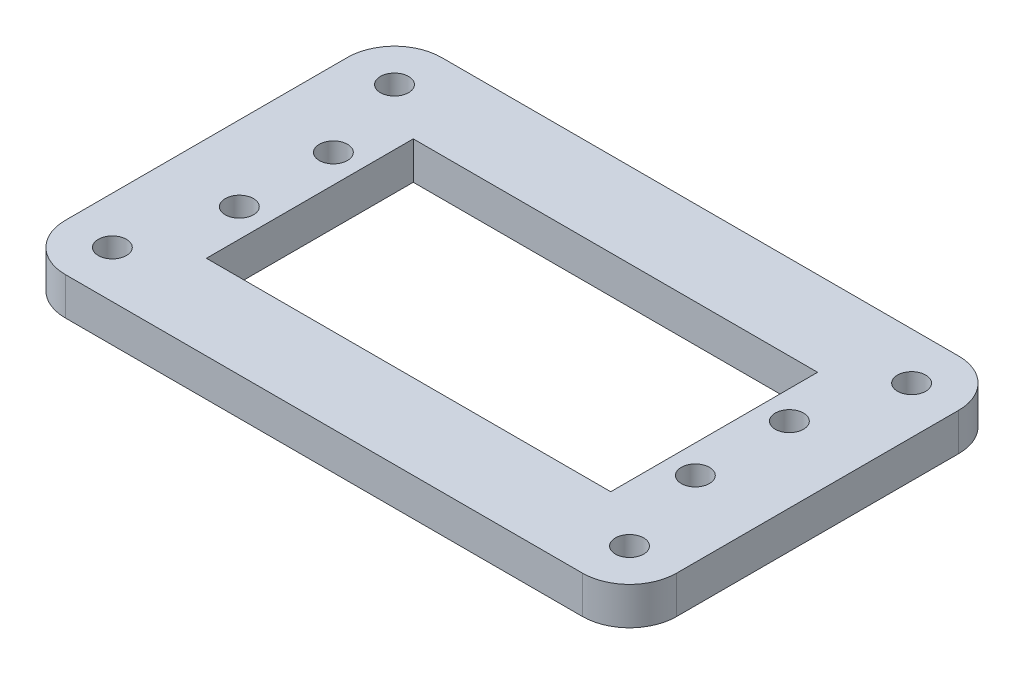
ISO-10303-21;
HEADER;
FILE_DESCRIPTION(('STEP AP214'),'2;1');
FILE_NAME('part.step','',(''),(''),'','','');
FILE_SCHEMA(('AUTOMOTIVE_DESIGN { 1 0 10303 214 1 1 1 1 }'));
ENDSEC;
DATA;
#1=APPLICATION_CONTEXT('core data for automotive mechanical design processes');
#2=APPLICATION_PROTOCOL_DEFINITION('international standard','automotive_design',2000,#1);
#3=PRODUCT_CONTEXT('',#1,'mechanical');
#4=PRODUCT('Part','Part','',(#3));
#5=PRODUCT_RELATED_PRODUCT_CATEGORY('part','',(#4));
#6=PRODUCT_DEFINITION_FORMATION('','',#4);
#7=PRODUCT_DEFINITION_CONTEXT('part definition',#1,'design');
#8=PRODUCT_DEFINITION('design','',#6,#7);
#9=PRODUCT_DEFINITION_SHAPE('','',#8);
#10=(LENGTH_UNIT() NAMED_UNIT(*) SI_UNIT(.MILLI.,.METRE.));
#11=(NAMED_UNIT(*) PLANE_ANGLE_UNIT() SI_UNIT($,.RADIAN.));
#12=(NAMED_UNIT(*) SI_UNIT($,.STERADIAN.) SOLID_ANGLE_UNIT());
#13=UNCERTAINTY_MEASURE_WITH_UNIT(LENGTH_MEASURE(1.E-05),#10,'distance_accuracy_value','');
#14=(GEOMETRIC_REPRESENTATION_CONTEXT(3) GLOBAL_UNCERTAINTY_ASSIGNED_CONTEXT((#13)) GLOBAL_UNIT_ASSIGNED_CONTEXT((#10,
#11,#12)) REPRESENTATION_CONTEXT('',''));
#15=CARTESIAN_POINT('',(0.,0.,0.));
#16=DIRECTION('',(0.,0.,1.));
#17=DIRECTION('',(1.,0.,0.));
#18=AXIS2_PLACEMENT_3D('',#15,#16,#17);
#19=CARTESIAN_POINT('',(-27.5,4.,15.));
#20=DIRECTION('',(0.,-1.,0.));
#21=DIRECTION('',(0.,0.,-1.));
#22=AXIS2_PLACEMENT_3D('',#19,#20,#21);
#23=CYLINDRICAL_SURFACE('',#22,5.);
#24=DIRECTION('',(0.,-1.,0.));
#25=VECTOR('',#24,1.);
#26=CARTESIAN_POINT('',(-27.5,4.,20.));
#27=LINE('',#26,#25);
#28=CARTESIAN_POINT('',(-27.5,4.,20.));
#29=VERTEX_POINT('',#28);
#30=CARTESIAN_POINT('',(-27.5,0.,20.));
#31=VERTEX_POINT('',#30);
#32=EDGE_CURVE('E253',#29,#31,#27,.T.);
#33=ORIENTED_EDGE('',*,*,#32,.F.);
#34=CARTESIAN_POINT('',(-27.5,4.,15.));
#35=DIRECTION('',(0.,1.,0.));
#36=DIRECTION('',(0.,0.,1.));
#37=AXIS2_PLACEMENT_3D('',#34,#35,#36);
#38=CIRCLE('',#37,5.);
#39=CARTESIAN_POINT('',(-32.5,4.,15.));
#40=VERTEX_POINT('',#39);
#41=EDGE_CURVE('E47',#40,#29,#38,.T.);
#42=ORIENTED_EDGE('',*,*,#41,.F.);
#43=DIRECTION('',(0.,-1.,0.));
#44=VECTOR('',#43,1.);
#45=CARTESIAN_POINT('',(-32.5,4.,15.));
#46=LINE('',#45,#44);
#47=CARTESIAN_POINT('',(-32.5,0.,15.));
#48=VERTEX_POINT('',#47);
#49=EDGE_CURVE('E257',#48,#40,#46,.F.);
#50=ORIENTED_EDGE('',*,*,#49,.F.);
#51=CARTESIAN_POINT('',(-27.5,0.,15.));
#52=DIRECTION('',(0.,1.,0.));
#53=DIRECTION('',(0.,0.,1.));
#54=AXIS2_PLACEMENT_3D('',#51,#52,#53);
#55=CIRCLE('',#54,5.);
#56=EDGE_CURVE('E11',#31,#48,#55,.F.);
#57=ORIENTED_EDGE('',*,*,#56,.F.);
#58=EDGE_LOOP('',(#33,#42,#50,#57));
#59=FACE_BOUND('',#58,.T.);
#60=ADVANCED_FACE('F39',(#59),#23,.T.);
#61=CARTESIAN_POINT('',(27.5,4.,15.));
#62=DIRECTION('',(0.,-1.,0.));
#63=DIRECTION('',(0.,0.,-1.));
#64=AXIS2_PLACEMENT_3D('',#61,#62,#63);
#65=CYLINDRICAL_SURFACE('',#64,5.);
#66=DIRECTION('',(0.,-1.,0.));
#67=VECTOR('',#66,1.);
#68=CARTESIAN_POINT('',(32.5,4.,15.));
#69=LINE('',#68,#67);
#70=CARTESIAN_POINT('',(32.5,4.,15.));
#71=VERTEX_POINT('',#70);
#72=CARTESIAN_POINT('',(32.5,0.,15.));
#73=VERTEX_POINT('',#72);
#74=EDGE_CURVE('E238',#71,#73,#69,.T.);
#75=ORIENTED_EDGE('',*,*,#74,.F.);
#76=CARTESIAN_POINT('',(27.5,4.,15.));
#77=DIRECTION('',(0.,1.,0.));
#78=DIRECTION('',(0.,0.,1.));
#79=AXIS2_PLACEMENT_3D('',#76,#77,#78);
#80=CIRCLE('',#79,5.);
#81=CARTESIAN_POINT('',(27.5,4.,20.));
#82=VERTEX_POINT('',#81);
#83=EDGE_CURVE('E246',#82,#71,#80,.T.);
#84=ORIENTED_EDGE('',*,*,#83,.F.);
#85=DIRECTION('',(0.,-1.,0.));
#86=VECTOR('',#85,1.);
#87=CARTESIAN_POINT('',(27.5,4.,20.));
#88=LINE('',#87,#86);
#89=CARTESIAN_POINT('',(27.5,0.,20.));
#90=VERTEX_POINT('',#89);
#91=EDGE_CURVE('E242',#90,#82,#88,.F.);
#92=ORIENTED_EDGE('',*,*,#91,.F.);
#93=CARTESIAN_POINT('',(27.5,0.,15.));
#94=DIRECTION('',(0.,1.,0.));
#95=DIRECTION('',(0.,0.,1.));
#96=AXIS2_PLACEMENT_3D('',#93,#94,#95);
#97=CIRCLE('',#96,5.);
#98=EDGE_CURVE('E249',#73,#90,#97,.F.);
#99=ORIENTED_EDGE('',*,*,#98,.F.);
#100=EDGE_LOOP('',(#75,#84,#92,#99));
#101=FACE_BOUND('',#100,.T.);
#102=ADVANCED_FACE('F269',(#101),#65,.T.);
#103=CARTESIAN_POINT('',(27.5,4.,-15.));
#104=DIRECTION('',(0.,-1.,0.));
#105=DIRECTION('',(0.,0.,-1.));
#106=AXIS2_PLACEMENT_3D('',#103,#104,#105);
#107=CYLINDRICAL_SURFACE('',#106,5.);
#108=DIRECTION('',(0.,-1.,0.));
#109=VECTOR('',#108,1.);
#110=CARTESIAN_POINT('',(27.5,4.,-20.));
#111=LINE('',#110,#109);
#112=CARTESIAN_POINT('',(27.5,4.,-20.));
#113=VERTEX_POINT('',#112);
#114=CARTESIAN_POINT('',(27.5,0.,-20.));
#115=VERTEX_POINT('',#114);
#116=EDGE_CURVE('E223',#113,#115,#111,.T.);
#117=ORIENTED_EDGE('',*,*,#116,.F.);
#118=CARTESIAN_POINT('',(27.5,4.,-15.));
#119=DIRECTION('',(0.,1.,0.));
#120=DIRECTION('',(0.,0.,1.));
#121=AXIS2_PLACEMENT_3D('',#118,#119,#120);
#122=CIRCLE('',#121,5.);
#123=CARTESIAN_POINT('',(32.5,4.,-15.));
#124=VERTEX_POINT('',#123);
#125=EDGE_CURVE('E231',#124,#113,#122,.T.);
#126=ORIENTED_EDGE('',*,*,#125,.F.);
#127=DIRECTION('',(0.,-1.,0.));
#128=VECTOR('',#127,1.);
#129=CARTESIAN_POINT('',(32.5,4.,-15.));
#130=LINE('',#129,#128);
#131=CARTESIAN_POINT('',(32.5,0.,-15.));
#132=VERTEX_POINT('',#131);
#133=EDGE_CURVE('E227',#132,#124,#130,.F.);
#134=ORIENTED_EDGE('',*,*,#133,.F.);
#135=CARTESIAN_POINT('',(27.5,0.,-15.));
#136=DIRECTION('',(0.,1.,0.));
#137=DIRECTION('',(0.,0.,1.));
#138=AXIS2_PLACEMENT_3D('',#135,#136,#137);
#139=CIRCLE('',#138,5.);
#140=EDGE_CURVE('E234',#115,#132,#139,.F.);
#141=ORIENTED_EDGE('',*,*,#140,.F.);
#142=EDGE_LOOP('',(#117,#126,#134,#141));
#143=FACE_BOUND('',#142,.T.);
#144=ADVANCED_FACE('F276',(#143),#107,.T.);
#145=CARTESIAN_POINT('',(-27.5,4.,-15.));
#146=DIRECTION('',(0.,-1.,0.));
#147=DIRECTION('',(0.,0.,-1.));
#148=AXIS2_PLACEMENT_3D('',#145,#146,#147);
#149=CYLINDRICAL_SURFACE('',#148,5.);
#150=DIRECTION('',(0.,-1.,0.));
#151=VECTOR('',#150,1.);
#152=CARTESIAN_POINT('',(-32.5,4.,-15.));
#153=LINE('',#152,#151);
#154=CARTESIAN_POINT('',(-32.5,4.,-15.));
#155=VERTEX_POINT('',#154);
#156=CARTESIAN_POINT('',(-32.5,0.,-15.));
#157=VERTEX_POINT('',#156);
#158=EDGE_CURVE('E197',#155,#157,#153,.T.);
#159=ORIENTED_EDGE('',*,*,#158,.F.);
#160=CARTESIAN_POINT('',(-27.5,4.,-15.));
#161=DIRECTION('',(0.,1.,0.));
#162=DIRECTION('',(0.,0.,1.));
#163=AXIS2_PLACEMENT_3D('',#160,#161,#162);
#164=CIRCLE('',#163,5.);
#165=CARTESIAN_POINT('',(-27.5,4.,-20.));
#166=VERTEX_POINT('',#165);
#167=EDGE_CURVE('E216',#166,#155,#164,.T.);
#168=ORIENTED_EDGE('',*,*,#167,.F.);
#169=DIRECTION('',(0.,-1.,0.));
#170=VECTOR('',#169,1.);
#171=CARTESIAN_POINT('',(-27.5,4.,-20.));
#172=LINE('',#171,#170);
#173=CARTESIAN_POINT('',(-27.5,0.,-20.));
#174=VERTEX_POINT('',#173);
#175=EDGE_CURVE('E212',#174,#166,#172,.F.);
#176=ORIENTED_EDGE('',*,*,#175,.F.);
#177=CARTESIAN_POINT('',(-27.5,0.,-15.));
#178=DIRECTION('',(0.,1.,0.));
#179=DIRECTION('',(0.,0.,1.));
#180=AXIS2_PLACEMENT_3D('',#177,#178,#179);
#181=CIRCLE('',#180,5.);
#182=EDGE_CURVE('E219',#157,#174,#181,.F.);
#183=ORIENTED_EDGE('',*,*,#182,.F.);
#184=EDGE_LOOP('',(#159,#168,#176,#183));
#185=FACE_BOUND('',#184,.T.);
#186=ADVANCED_FACE('F289',(#185),#149,.T.);
#187=CARTESIAN_POINT('',(0.,4.,0.));
#188=DIRECTION('',(0.,1.,0.));
#189=DIRECTION('',(0.,0.,1.));
#190=AXIS2_PLACEMENT_3D('',#187,#188,#189);
#191=PLANE('',#190);
#192=CARTESIAN_POINT('',(-27.5,4.,-15.));
#193=DIRECTION('',(0.,1.,0.));
#194=DIRECTION('',(0.,0.,1.));
#195=AXIS2_PLACEMENT_3D('',#192,#193,#194);
#196=CIRCLE('',#195,1.5);
#197=CARTESIAN_POINT('',(-27.5,4.,-13.5));
#198=VERTEX_POINT('',#197);
#199=EDGE_CURVE('E383',#198,#198,#196,.T.);
#200=ORIENTED_EDGE('',*,*,#199,.F.);
#201=EDGE_LOOP('',(#200));
#202=FACE_BOUND('',#201,.T.);
#203=CARTESIAN_POINT('',(24.5,4.,5.));
#204=DIRECTION('',(0.,1.,0.));
#205=DIRECTION('',(0.,0.,1.));
#206=AXIS2_PLACEMENT_3D('',#203,#204,#205);
#207=CIRCLE('',#206,1.5);
#208=CARTESIAN_POINT('',(24.5,4.,6.5));
#209=VERTEX_POINT('',#208);
#210=EDGE_CURVE('E405',#209,#209,#207,.T.);
#211=ORIENTED_EDGE('',*,*,#210,.F.);
#212=EDGE_LOOP('',(#211));
#213=FACE_BOUND('',#212,.T.);
#214=CARTESIAN_POINT('',(24.5,4.,-5.));
#215=DIRECTION('',(0.,1.,0.));
#216=DIRECTION('',(0.,0.,1.));
#217=AXIS2_PLACEMENT_3D('',#214,#215,#216);
#218=CIRCLE('',#217,1.5);
#219=CARTESIAN_POINT('',(24.5,4.,-3.5));
#220=VERTEX_POINT('',#219);
#221=EDGE_CURVE('E404',#220,#220,#218,.T.);
#222=ORIENTED_EDGE('',*,*,#221,.F.);
#223=EDGE_LOOP('',(#222));
#224=FACE_BOUND('',#223,.T.);
#225=CARTESIAN_POINT('',(-24.5,4.,4.49549694848628));
#226=DIRECTION('',(0.,1.,0.));
#227=DIRECTION('',(0.,0.,1.));
#228=AXIS2_PLACEMENT_3D('',#225,#226,#227);
#229=CIRCLE('',#228,1.5);
#230=CARTESIAN_POINT('',(-24.5,4.,5.99549694848628));
#231=VERTEX_POINT('',#230);
#232=EDGE_CURVE('E420',#231,#231,#229,.T.);
#233=ORIENTED_EDGE('',*,*,#232,.F.);
#234=EDGE_LOOP('',(#233));
#235=FACE_BOUND('',#234,.T.);
#236=CARTESIAN_POINT('',(27.5,4.,-15.));
#237=DIRECTION('',(0.,1.,0.));
#238=DIRECTION('',(0.,0.,1.));
#239=AXIS2_PLACEMENT_3D('',#236,#237,#238);
#240=CIRCLE('',#239,1.5);
#241=CARTESIAN_POINT('',(27.5,4.,-13.5));
#242=VERTEX_POINT('',#241);
#243=EDGE_CURVE('E376',#242,#242,#240,.T.);
#244=ORIENTED_EDGE('',*,*,#243,.F.);
#245=EDGE_LOOP('',(#244));
#246=FACE_BOUND('',#245,.T.);
#247=CARTESIAN_POINT('',(27.5,4.,15.));
#248=DIRECTION('',(0.,1.,0.));
#249=DIRECTION('',(0.,0.,1.));
#250=AXIS2_PLACEMENT_3D('',#247,#248,#249);
#251=CIRCLE('',#250,1.5);
#252=CARTESIAN_POINT('',(27.5,4.,16.5));
#253=VERTEX_POINT('',#252);
#254=EDGE_CURVE('E386',#253,#253,#251,.T.);
#255=ORIENTED_EDGE('',*,*,#254,.F.);
#256=EDGE_LOOP('',(#255));
#257=FACE_BOUND('',#256,.T.);
#258=CARTESIAN_POINT('',(-27.5,4.,15.));
#259=DIRECTION('',(0.,1.,0.));
#260=DIRECTION('',(0.,0.,1.));
#261=AXIS2_PLACEMENT_3D('',#258,#259,#260);
#262=CIRCLE('',#261,1.5);
#263=CARTESIAN_POINT('',(-27.5,4.,16.5));
#264=VERTEX_POINT('',#263);
#265=EDGE_CURVE('E396',#264,#264,#262,.T.);
#266=ORIENTED_EDGE('',*,*,#265,.F.);
#267=EDGE_LOOP('',(#266));
#268=FACE_BOUND('',#267,.T.);
#269=CARTESIAN_POINT('',(-24.5,4.,-5.50450305151372));
#270=DIRECTION('',(0.,1.,0.));
#271=DIRECTION('',(0.,0.,1.));
#272=AXIS2_PLACEMENT_3D('',#269,#270,#271);
#273=CIRCLE('',#272,1.5);
#274=CARTESIAN_POINT('',(-24.5,4.,-4.00450305151372));
#275=VERTEX_POINT('',#274);
#276=EDGE_CURVE('E419',#275,#275,#273,.T.);
#277=ORIENTED_EDGE('',*,*,#276,.F.);
#278=EDGE_LOOP('',(#277));
#279=FACE_BOUND('',#278,.T.);
#280=DIRECTION('',(0.,0.,1.));
#281=VECTOR('',#280,1.);
#282=CARTESIAN_POINT('',(-32.5,4.,-20.));
#283=LINE('',#282,#281);
#284=EDGE_CURVE('E190',#155,#40,#283,.T.);
#285=ORIENTED_EDGE('',*,*,#284,.T.);
#286=ORIENTED_EDGE('',*,*,#41,.T.);
#287=DIRECTION('',(1.,0.,0.));
#288=VECTOR('',#287,1.);
#289=CARTESIAN_POINT('',(-32.5,4.,20.));
#290=LINE('',#289,#288);
#291=EDGE_CURVE('E194',#29,#82,#290,.T.);
#292=ORIENTED_EDGE('',*,*,#291,.T.);
#293=ORIENTED_EDGE('',*,*,#83,.T.);
#294=DIRECTION('',(0.,0.,-1.));
#295=VECTOR('',#294,1.);
#296=CARTESIAN_POINT('',(32.5,4.,-20.));
#297=LINE('',#296,#295);
#298=EDGE_CURVE('E183',#71,#124,#297,.T.);
#299=ORIENTED_EDGE('',*,*,#298,.T.);
#300=ORIENTED_EDGE('',*,*,#125,.T.);
#301=DIRECTION('',(-1.,0.,0.));
#302=VECTOR('',#301,1.);
#303=CARTESIAN_POINT('',(-32.5,4.,-20.));
#304=LINE('',#303,#302);
#305=EDGE_CURVE('E186',#113,#166,#304,.T.);
#306=ORIENTED_EDGE('',*,*,#305,.T.);
#307=ORIENTED_EDGE('',*,*,#167,.T.);
#308=EDGE_LOOP('',(#285,#286,#292,#293,#299,#300,#306,#307));
#309=FACE_BOUND('',#308,.T.);
#310=DIRECTION('',(-1.,0.,0.));
#311=VECTOR('',#310,1.);
#312=CARTESIAN_POINT('',(-21.5,4.,-11.));
#313=LINE('',#312,#311);
#314=CARTESIAN_POINT('',(21.5,4.,-11.));
#315=VERTEX_POINT('',#314);
#316=CARTESIAN_POINT('',(-21.5,4.,-11.));
#317=VERTEX_POINT('',#316);
#318=EDGE_CURVE('E138',#315,#317,#313,.T.);
#319=ORIENTED_EDGE('',*,*,#318,.F.);
#320=DIRECTION('',(0.,0.,-1.));
#321=VECTOR('',#320,1.);
#322=CARTESIAN_POINT('',(21.5,4.,-11.));
#323=LINE('',#322,#321);
#324=CARTESIAN_POINT('',(21.5,4.,11.));
#325=VERTEX_POINT('',#324);
#326=EDGE_CURVE('E127',#325,#315,#323,.T.);
#327=ORIENTED_EDGE('',*,*,#326,.F.);
#328=DIRECTION('',(1.,0.,0.));
#329=VECTOR('',#328,1.);
#330=CARTESIAN_POINT('',(-21.5,4.,11.));
#331=LINE('',#330,#329);
#332=CARTESIAN_POINT('',(-21.5,4.,11.));
#333=VERTEX_POINT('',#332);
#334=EDGE_CURVE('E157',#333,#325,#331,.T.);
#335=ORIENTED_EDGE('',*,*,#334,.F.);
#336=DIRECTION('',(0.,0.,1.));
#337=VECTOR('',#336,1.);
#338=CARTESIAN_POINT('',(-21.5,4.,-11.));
#339=LINE('',#338,#337);
#340=EDGE_CURVE('E153',#317,#333,#339,.T.);
#341=ORIENTED_EDGE('',*,*,#340,.F.);
#342=EDGE_LOOP('',(#319,#327,#335,#341));
#343=FACE_BOUND('',#342,.T.);
#344=ADVANCED_FACE('F151',(#202,#213,#224,#235,#246,#257,#268,#279,#309,#343),#191,.T.);
#345=CARTESIAN_POINT('',(0.,0.,0.));
#346=DIRECTION('',(0.,1.,0.));
#347=DIRECTION('',(0.,0.,1.));
#348=AXIS2_PLACEMENT_3D('',#345,#346,#347);
#349=PLANE('',#348);
#350=CARTESIAN_POINT('',(-27.5,0.,-15.));
#351=DIRECTION('',(0.,1.,0.));
#352=DIRECTION('',(0.,0.,1.));
#353=AXIS2_PLACEMENT_3D('',#350,#351,#352);
#354=CIRCLE('',#353,1.5);
#355=CARTESIAN_POINT('',(-27.5,0.,-13.5));
#356=VERTEX_POINT('',#355);
#357=EDGE_CURVE('E409',#356,#356,#354,.T.);
#358=ORIENTED_EDGE('',*,*,#357,.T.);
#359=EDGE_LOOP('',(#358));
#360=FACE_BOUND('',#359,.T.);
#361=CARTESIAN_POINT('',(24.5,0.,5.));
#362=DIRECTION('',(0.,1.,0.));
#363=DIRECTION('',(0.,0.,1.));
#364=AXIS2_PLACEMENT_3D('',#361,#362,#363);
#365=CIRCLE('',#364,1.5);
#366=CARTESIAN_POINT('',(24.5,0.,6.5));
#367=VERTEX_POINT('',#366);
#368=EDGE_CURVE('E400',#367,#367,#365,.T.);
#369=ORIENTED_EDGE('',*,*,#368,.T.);
#370=EDGE_LOOP('',(#369));
#371=FACE_BOUND('',#370,.T.);
#372=CARTESIAN_POINT('',(24.5,0.,-5.));
#373=DIRECTION('',(0.,1.,0.));
#374=DIRECTION('',(0.,0.,1.));
#375=AXIS2_PLACEMENT_3D('',#372,#373,#374);
#376=CIRCLE('',#375,1.5);
#377=CARTESIAN_POINT('',(24.5,0.,-3.5));
#378=VERTEX_POINT('',#377);
#379=EDGE_CURVE('E424',#378,#378,#376,.T.);
#380=ORIENTED_EDGE('',*,*,#379,.T.);
#381=EDGE_LOOP('',(#380));
#382=FACE_BOUND('',#381,.T.);
#383=CARTESIAN_POINT('',(-24.5,0.,4.49549694848628));
#384=DIRECTION('',(0.,1.,0.));
#385=DIRECTION('',(0.,0.,1.));
#386=AXIS2_PLACEMENT_3D('',#383,#384,#385);
#387=CIRCLE('',#386,1.5);
#388=CARTESIAN_POINT('',(-24.5,0.,5.99549694848628));
#389=VERTEX_POINT('',#388);
#390=EDGE_CURVE('E415',#389,#389,#387,.T.);
#391=ORIENTED_EDGE('',*,*,#390,.T.);
#392=EDGE_LOOP('',(#391));
#393=FACE_BOUND('',#392,.T.);
#394=CARTESIAN_POINT('',(27.5,0.,-15.));
#395=DIRECTION('',(0.,1.,0.));
#396=DIRECTION('',(0.,0.,1.));
#397=AXIS2_PLACEMENT_3D('',#394,#395,#396);
#398=CIRCLE('',#397,1.5);
#399=CARTESIAN_POINT('',(27.5,0.,-13.5));
#400=VERTEX_POINT('',#399);
#401=EDGE_CURVE('E373',#400,#400,#398,.T.);
#402=ORIENTED_EDGE('',*,*,#401,.T.);
#403=EDGE_LOOP('',(#402));
#404=FACE_BOUND('',#403,.T.);
#405=CARTESIAN_POINT('',(27.5,0.,15.));
#406=DIRECTION('',(0.,1.,0.));
#407=DIRECTION('',(0.,0.,1.));
#408=AXIS2_PLACEMENT_3D('',#405,#406,#407);
#409=CIRCLE('',#408,1.5);
#410=CARTESIAN_POINT('',(27.5,0.,16.5));
#411=VERTEX_POINT('',#410);
#412=EDGE_CURVE('E379',#411,#411,#409,.T.);
#413=ORIENTED_EDGE('',*,*,#412,.T.);
#414=EDGE_LOOP('',(#413));
#415=FACE_BOUND('',#414,.T.);
#416=CARTESIAN_POINT('',(-27.5,0.,15.));
#417=DIRECTION('',(0.,1.,0.));
#418=DIRECTION('',(0.,0.,1.));
#419=AXIS2_PLACEMENT_3D('',#416,#417,#418);
#420=CIRCLE('',#419,1.5);
#421=CARTESIAN_POINT('',(-27.5,0.,16.5));
#422=VERTEX_POINT('',#421);
#423=EDGE_CURVE('E392',#422,#422,#420,.T.);
#424=ORIENTED_EDGE('',*,*,#423,.T.);
#425=EDGE_LOOP('',(#424));
#426=FACE_BOUND('',#425,.T.);
#427=CARTESIAN_POINT('',(-24.5,0.,-5.50450305151372));
#428=DIRECTION('',(0.,1.,0.));
#429=DIRECTION('',(0.,0.,1.));
#430=AXIS2_PLACEMENT_3D('',#427,#428,#429);
#431=CIRCLE('',#430,1.5);
#432=CARTESIAN_POINT('',(-24.5,0.,-4.00450305151372));
#433=VERTEX_POINT('',#432);
#434=EDGE_CURVE('E166',#433,#433,#431,.T.);
#435=ORIENTED_EDGE('',*,*,#434,.T.);
#436=EDGE_LOOP('',(#435));
#437=FACE_BOUND('',#436,.T.);
#438=DIRECTION('',(1.,0.,0.));
#439=VECTOR('',#438,1.);
#440=CARTESIAN_POINT('',(-32.5,0.,20.));
#441=LINE('',#440,#439);
#442=EDGE_CURVE('E187',#31,#90,#441,.T.);
#443=ORIENTED_EDGE('',*,*,#442,.F.);
#444=ORIENTED_EDGE('',*,*,#56,.T.);
#445=DIRECTION('',(0.,0.,1.));
#446=VECTOR('',#445,1.);
#447=CARTESIAN_POINT('',(-32.5,0.,-20.));
#448=LINE('',#447,#446);
#449=EDGE_CURVE('E203',#157,#48,#448,.T.);
#450=ORIENTED_EDGE('',*,*,#449,.F.);
#451=ORIENTED_EDGE('',*,*,#182,.T.);
#452=DIRECTION('',(-1.,0.,0.));
#453=VECTOR('',#452,1.);
#454=CARTESIAN_POINT('',(-32.5,0.,-20.));
#455=LINE('',#454,#453);
#456=EDGE_CURVE('E200',#115,#174,#455,.T.);
#457=ORIENTED_EDGE('',*,*,#456,.F.);
#458=ORIENTED_EDGE('',*,*,#140,.T.);
#459=DIRECTION('',(0.,0.,-1.));
#460=VECTOR('',#459,1.);
#461=CARTESIAN_POINT('',(32.5,0.,-20.));
#462=LINE('',#461,#460);
#463=EDGE_CURVE('E147',#73,#132,#462,.T.);
#464=ORIENTED_EDGE('',*,*,#463,.F.);
#465=ORIENTED_EDGE('',*,*,#98,.T.);
#466=EDGE_LOOP('',(#443,#444,#450,#451,#457,#458,#464,#465));
#467=FACE_BOUND('',#466,.T.);
#468=DIRECTION('',(0.,0.,-1.));
#469=VECTOR('',#468,1.);
#470=CARTESIAN_POINT('',(21.5,0.,-11.));
#471=LINE('',#470,#469);
#472=CARTESIAN_POINT('',(21.5,0.,11.));
#473=VERTEX_POINT('',#472);
#474=CARTESIAN_POINT('',(21.5,0.,-11.));
#475=VERTEX_POINT('',#474);
#476=EDGE_CURVE('E163',#473,#475,#471,.T.);
#477=ORIENTED_EDGE('',*,*,#476,.T.);
#478=DIRECTION('',(-1.,0.,0.));
#479=VECTOR('',#478,1.);
#480=CARTESIAN_POINT('',(-21.5,0.,-11.));
#481=LINE('',#480,#479);
#482=CARTESIAN_POINT('',(-21.5,0.,-11.));
#483=VERTEX_POINT('',#482);
#484=EDGE_CURVE('E145',#475,#483,#481,.T.);
#485=ORIENTED_EDGE('',*,*,#484,.T.);
#486=DIRECTION('',(0.,0.,1.));
#487=VECTOR('',#486,1.);
#488=CARTESIAN_POINT('',(-21.5,0.,-11.));
#489=LINE('',#488,#487);
#490=CARTESIAN_POINT('',(-21.5,0.,11.));
#491=VERTEX_POINT('',#490);
#492=EDGE_CURVE('E169',#483,#491,#489,.T.);
#493=ORIENTED_EDGE('',*,*,#492,.T.);
#494=DIRECTION('',(1.,0.,0.));
#495=VECTOR('',#494,1.);
#496=CARTESIAN_POINT('',(-21.5,0.,11.));
#497=LINE('',#496,#495);
#498=EDGE_CURVE('E139',#491,#473,#497,.T.);
#499=ORIENTED_EDGE('',*,*,#498,.T.);
#500=EDGE_LOOP('',(#477,#485,#493,#499));
#501=FACE_BOUND('',#500,.T.);
#502=ADVANCED_FACE('F281',(#360,#371,#382,#393,#404,#415,#426,#437,#467,#501),#349,.F.);
#503=CARTESIAN_POINT('',(32.5,4.,-20.));
#504=DIRECTION('',(-1.,0.,0.));
#505=DIRECTION('',(0.,0.,1.));
#506=AXIS2_PLACEMENT_3D('',#503,#504,#505);
#507=PLANE('',#506);
#508=ORIENTED_EDGE('',*,*,#298,.F.);
#509=ORIENTED_EDGE('',*,*,#74,.T.);
#510=ORIENTED_EDGE('',*,*,#463,.T.);
#511=ORIENTED_EDGE('',*,*,#133,.T.);
#512=EDGE_LOOP('',(#508,#509,#510,#511));
#513=FACE_BOUND('',#512,.T.);
#514=ADVANCED_FACE('F278',(#513),#507,.F.);
#515=CARTESIAN_POINT('',(-32.5,4.,-20.));
#516=DIRECTION('',(0.,0.,1.));
#517=DIRECTION('',(1.,0.,0.));
#518=AXIS2_PLACEMENT_3D('',#515,#516,#517);
#519=PLANE('',#518);
#520=ORIENTED_EDGE('',*,*,#305,.F.);
#521=ORIENTED_EDGE('',*,*,#116,.T.);
#522=ORIENTED_EDGE('',*,*,#456,.T.);
#523=ORIENTED_EDGE('',*,*,#175,.T.);
#524=EDGE_LOOP('',(#520,#521,#522,#523));
#525=FACE_BOUND('',#524,.T.);
#526=ADVANCED_FACE('F284',(#525),#519,.F.);
#527=CARTESIAN_POINT('',(-32.5,4.,-20.));
#528=DIRECTION('',(1.,0.,0.));
#529=DIRECTION('',(0.,0.,-1.));
#530=AXIS2_PLACEMENT_3D('',#527,#528,#529);
#531=PLANE('',#530);
#532=ORIENTED_EDGE('',*,*,#449,.T.);
#533=ORIENTED_EDGE('',*,*,#49,.T.);
#534=ORIENTED_EDGE('',*,*,#284,.F.);
#535=ORIENTED_EDGE('',*,*,#158,.T.);
#536=EDGE_LOOP('',(#532,#533,#534,#535));
#537=FACE_BOUND('',#536,.T.);
#538=ADVANCED_FACE('F291',(#537),#531,.F.);
#539=CARTESIAN_POINT('',(-32.5,4.,20.));
#540=DIRECTION('',(0.,0.,-1.));
#541=DIRECTION('',(-1.,0.,0.));
#542=AXIS2_PLACEMENT_3D('',#539,#540,#541);
#543=PLANE('',#542);
#544=ORIENTED_EDGE('',*,*,#291,.F.);
#545=ORIENTED_EDGE('',*,*,#32,.T.);
#546=ORIENTED_EDGE('',*,*,#442,.T.);
#547=ORIENTED_EDGE('',*,*,#91,.T.);
#548=EDGE_LOOP('',(#544,#545,#546,#547));
#549=FACE_BOUND('',#548,.T.);
#550=ADVANCED_FACE('F265',(#549),#543,.F.);
#551=CARTESIAN_POINT('',(21.5,4.,-11.));
#552=DIRECTION('',(-1.,0.,0.));
#553=DIRECTION('',(0.,0.,1.));
#554=AXIS2_PLACEMENT_3D('',#551,#552,#553);
#555=PLANE('',#554);
#556=ORIENTED_EDGE('',*,*,#476,.F.);
#557=DIRECTION('',(0.,-1.,0.));
#558=VECTOR('',#557,1.);
#559=CARTESIAN_POINT('',(21.5,4.,11.));
#560=LINE('',#559,#558);
#561=EDGE_CURVE('E133',#325,#473,#560,.T.);
#562=ORIENTED_EDGE('',*,*,#561,.F.);
#563=ORIENTED_EDGE('',*,*,#326,.T.);
#564=DIRECTION('',(0.,-1.,0.));
#565=VECTOR('',#564,1.);
#566=CARTESIAN_POINT('',(21.5,4.,-11.));
#567=LINE('',#566,#565);
#568=EDGE_CURVE('E130',#315,#475,#567,.T.);
#569=ORIENTED_EDGE('',*,*,#568,.T.);
#570=EDGE_LOOP('',(#556,#562,#563,#569));
#571=FACE_BOUND('',#570,.T.);
#572=ADVANCED_FACE('F129',(#571),#555,.T.);
#573=CARTESIAN_POINT('',(-21.5,4.,-11.));
#574=DIRECTION('',(0.,0.,1.));
#575=DIRECTION('',(1.,0.,0.));
#576=AXIS2_PLACEMENT_3D('',#573,#574,#575);
#577=PLANE('',#576);
#578=ORIENTED_EDGE('',*,*,#484,.F.);
#579=ORIENTED_EDGE('',*,*,#568,.F.);
#580=ORIENTED_EDGE('',*,*,#318,.T.);
#581=DIRECTION('',(0.,-1.,0.));
#582=VECTOR('',#581,1.);
#583=CARTESIAN_POINT('',(-21.5,4.,-11.));
#584=LINE('',#583,#582);
#585=EDGE_CURVE('E148',#317,#483,#584,.T.);
#586=ORIENTED_EDGE('',*,*,#585,.T.);
#587=EDGE_LOOP('',(#578,#579,#580,#586));
#588=FACE_BOUND('',#587,.T.);
#589=ADVANCED_FACE('F142',(#588),#577,.T.);
#590=CARTESIAN_POINT('',(-21.5,4.,-11.));
#591=DIRECTION('',(1.,0.,0.));
#592=DIRECTION('',(0.,0.,-1.));
#593=AXIS2_PLACEMENT_3D('',#590,#591,#592);
#594=PLANE('',#593);
#595=ORIENTED_EDGE('',*,*,#492,.F.);
#596=ORIENTED_EDGE('',*,*,#585,.F.);
#597=ORIENTED_EDGE('',*,*,#340,.T.);
#598=DIRECTION('',(0.,-1.,0.));
#599=VECTOR('',#598,1.);
#600=CARTESIAN_POINT('',(-21.5,4.,11.));
#601=LINE('',#600,#599);
#602=EDGE_CURVE('E178',#333,#491,#601,.T.);
#603=ORIENTED_EDGE('',*,*,#602,.T.);
#604=EDGE_LOOP('',(#595,#596,#597,#603));
#605=FACE_BOUND('',#604,.T.);
#606=ADVANCED_FACE('F329',(#605),#594,.T.);
#607=CARTESIAN_POINT('',(-21.5,4.,11.));
#608=DIRECTION('',(0.,0.,-1.));
#609=DIRECTION('',(-1.,0.,0.));
#610=AXIS2_PLACEMENT_3D('',#607,#608,#609);
#611=PLANE('',#610);
#612=ORIENTED_EDGE('',*,*,#498,.F.);
#613=ORIENTED_EDGE('',*,*,#602,.F.);
#614=ORIENTED_EDGE('',*,*,#334,.T.);
#615=ORIENTED_EDGE('',*,*,#561,.T.);
#616=EDGE_LOOP('',(#612,#613,#614,#615));
#617=FACE_BOUND('',#616,.T.);
#618=ADVANCED_FACE('F332',(#617),#611,.T.);
#619=CARTESIAN_POINT('',(-24.5,0.,-5.50450305151372));
#620=DIRECTION('',(0.,1.,0.));
#621=DIRECTION('',(0.,0.,1.));
#622=AXIS2_PLACEMENT_3D('',#619,#620,#621);
#623=CYLINDRICAL_SURFACE('',#622,1.5);
#624=ORIENTED_EDGE('',*,*,#434,.F.);
#625=EDGE_LOOP('',(#624));
#626=FACE_BOUND('',#625,.T.);
#627=ORIENTED_EDGE('',*,*,#276,.T.);
#628=EDGE_LOOP('',(#627));
#629=FACE_BOUND('',#628,.T.);
#630=ADVANCED_FACE('F336',(#626,#629),#623,.F.);
#631=CARTESIAN_POINT('',(-27.5,0.,15.));
#632=DIRECTION('',(0.,1.,0.));
#633=DIRECTION('',(0.,0.,1.));
#634=AXIS2_PLACEMENT_3D('',#631,#632,#633);
#635=CYLINDRICAL_SURFACE('',#634,1.5);
#636=ORIENTED_EDGE('',*,*,#423,.F.);
#637=EDGE_LOOP('',(#636));
#638=FACE_BOUND('',#637,.T.);
#639=ORIENTED_EDGE('',*,*,#265,.T.);
#640=EDGE_LOOP('',(#639));
#641=FACE_BOUND('',#640,.T.);
#642=ADVANCED_FACE('F340',(#638,#641),#635,.F.);
#643=CARTESIAN_POINT('',(27.5,0.,15.));
#644=DIRECTION('',(0.,1.,0.));
#645=DIRECTION('',(0.,0.,1.));
#646=AXIS2_PLACEMENT_3D('',#643,#644,#645);
#647=CYLINDRICAL_SURFACE('',#646,1.5);
#648=ORIENTED_EDGE('',*,*,#412,.F.);
#649=EDGE_LOOP('',(#648));
#650=FACE_BOUND('',#649,.T.);
#651=ORIENTED_EDGE('',*,*,#254,.T.);
#652=EDGE_LOOP('',(#651));
#653=FACE_BOUND('',#652,.T.);
#654=ADVANCED_FACE('F361',(#650,#653),#647,.F.);
#655=CARTESIAN_POINT('',(27.5,0.,-15.));
#656=DIRECTION('',(0.,1.,0.));
#657=DIRECTION('',(0.,0.,1.));
#658=AXIS2_PLACEMENT_3D('',#655,#656,#657);
#659=CYLINDRICAL_SURFACE('',#658,1.5);
#660=ORIENTED_EDGE('',*,*,#401,.F.);
#661=EDGE_LOOP('',(#660));
#662=FACE_BOUND('',#661,.T.);
#663=ORIENTED_EDGE('',*,*,#243,.T.);
#664=EDGE_LOOP('',(#663));
#665=FACE_BOUND('',#664,.T.);
#666=ADVANCED_FACE('F350',(#662,#665),#659,.F.);
#667=CARTESIAN_POINT('',(-24.5,0.,4.49549694848628));
#668=DIRECTION('',(0.,1.,0.));
#669=DIRECTION('',(0.,0.,1.));
#670=AXIS2_PLACEMENT_3D('',#667,#668,#669);
#671=CYLINDRICAL_SURFACE('',#670,1.5);
#672=ORIENTED_EDGE('',*,*,#390,.F.);
#673=EDGE_LOOP('',(#672));
#674=FACE_BOUND('',#673,.T.);
#675=ORIENTED_EDGE('',*,*,#232,.T.);
#676=EDGE_LOOP('',(#675));
#677=FACE_BOUND('',#676,.T.);
#678=ADVANCED_FACE('F346',(#674,#677),#671,.F.);
#679=CARTESIAN_POINT('',(24.5,0.,-5.));
#680=DIRECTION('',(0.,1.,0.));
#681=DIRECTION('',(0.,0.,1.));
#682=AXIS2_PLACEMENT_3D('',#679,#680,#681);
#683=CYLINDRICAL_SURFACE('',#682,1.5);
#684=ORIENTED_EDGE('',*,*,#379,.F.);
#685=EDGE_LOOP('',(#684));
#686=FACE_BOUND('',#685,.T.);
#687=ORIENTED_EDGE('',*,*,#221,.T.);
#688=EDGE_LOOP('',(#687));
#689=FACE_BOUND('',#688,.T.);
#690=ADVANCED_FACE('F342',(#686,#689),#683,.F.);
#691=CARTESIAN_POINT('',(24.5,0.,5.));
#692=DIRECTION('',(0.,1.,0.));
#693=DIRECTION('',(0.,0.,1.));
#694=AXIS2_PLACEMENT_3D('',#691,#692,#693);
#695=CYLINDRICAL_SURFACE('',#694,1.5);
#696=ORIENTED_EDGE('',*,*,#368,.F.);
#697=EDGE_LOOP('',(#696));
#698=FACE_BOUND('',#697,.T.);
#699=ORIENTED_EDGE('',*,*,#210,.T.);
#700=EDGE_LOOP('',(#699));
#701=FACE_BOUND('',#700,.T.);
#702=ADVANCED_FACE('F345',(#698,#701),#695,.F.);
#703=CARTESIAN_POINT('',(-27.5,0.,-15.));
#704=DIRECTION('',(0.,1.,0.));
#705=DIRECTION('',(0.,0.,1.));
#706=AXIS2_PLACEMENT_3D('',#703,#704,#705);
#707=CYLINDRICAL_SURFACE('',#706,1.5);
#708=ORIENTED_EDGE('',*,*,#357,.F.);
#709=EDGE_LOOP('',(#708));
#710=FACE_BOUND('',#709,.T.);
#711=ORIENTED_EDGE('',*,*,#199,.T.);
#712=EDGE_LOOP('',(#711));
#713=FACE_BOUND('',#712,.T.);
#714=ADVANCED_FACE('F352',(#710,#713),#707,.F.);
#715=CLOSED_SHELL('',(#60,#102,#144,#186,#344,#502,#514,#526,#538,#550,#572,#589,#606,#618,#630,
#642,#654,#666,#678,#690,#702,#714));
#716=MANIFOLD_SOLID_BREP('B2',#715);
#717=ADVANCED_BREP_SHAPE_REPRESENTATION('',(#18,#716),#14);
#718=SHAPE_DEFINITION_REPRESENTATION(#9,#717);
ENDSEC;
END-ISO-10303-21;
